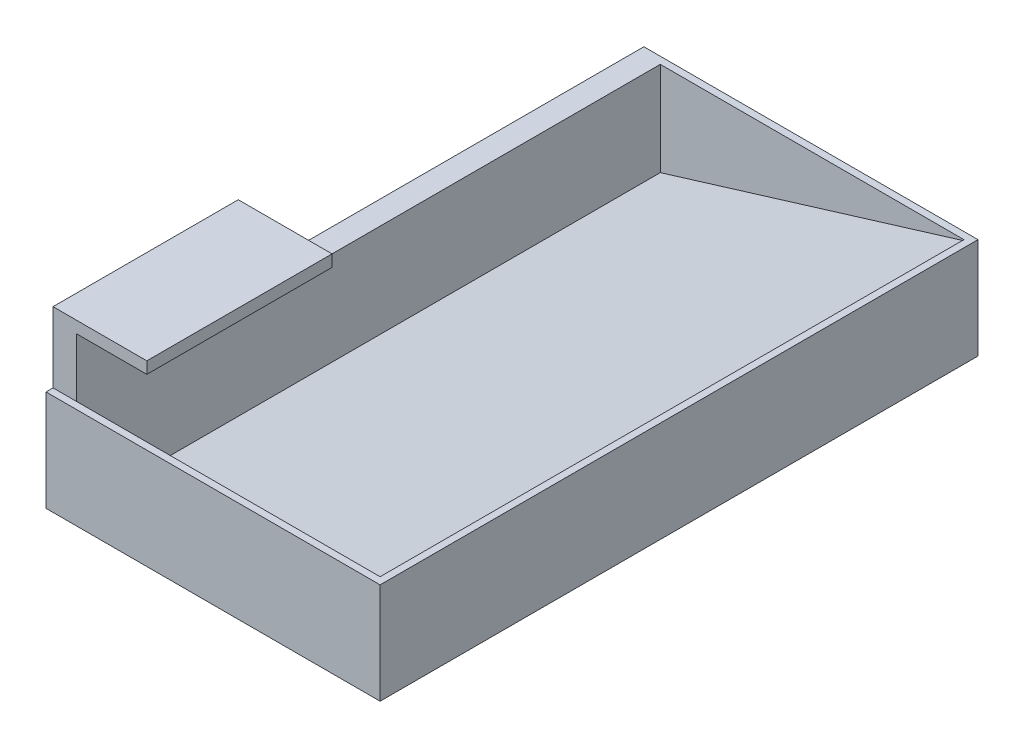
ISO-10303-21;
HEADER;
FILE_DESCRIPTION(('STEP AP214'),'2;1');
FILE_NAME('part.step','',(''),(''),'','','');
FILE_SCHEMA(('AUTOMOTIVE_DESIGN { 1 0 10303 214 1 1 1 1 }'));
ENDSEC;
DATA;
#1=APPLICATION_CONTEXT('core data for automotive mechanical design processes');
#2=APPLICATION_PROTOCOL_DEFINITION('international standard','automotive_design',2000,#1);
#3=PRODUCT_CONTEXT('',#1,'mechanical');
#4=PRODUCT('Part','Part','',(#3));
#5=PRODUCT_RELATED_PRODUCT_CATEGORY('part','',(#4));
#6=PRODUCT_DEFINITION_FORMATION('','',#4);
#7=PRODUCT_DEFINITION_CONTEXT('part definition',#1,'design');
#8=PRODUCT_DEFINITION('design','',#6,#7);
#9=PRODUCT_DEFINITION_SHAPE('','',#8);
#10=(LENGTH_UNIT() NAMED_UNIT(*) SI_UNIT(.MILLI.,.METRE.));
#11=(NAMED_UNIT(*) PLANE_ANGLE_UNIT() SI_UNIT($,.RADIAN.));
#12=(NAMED_UNIT(*) SI_UNIT($,.STERADIAN.) SOLID_ANGLE_UNIT());
#13=UNCERTAINTY_MEASURE_WITH_UNIT(LENGTH_MEASURE(1.E-05),#10,'distance_accuracy_value','');
#14=(GEOMETRIC_REPRESENTATION_CONTEXT(3) GLOBAL_UNCERTAINTY_ASSIGNED_CONTEXT((#13)) GLOBAL_UNIT_ASSIGNED_CONTEXT((#10,
#11,#12)) REPRESENTATION_CONTEXT('',''));
#15=CARTESIAN_POINT('',(0.,0.,0.));
#16=DIRECTION('',(0.,0.,1.));
#17=DIRECTION('',(1.,0.,0.));
#18=AXIS2_PLACEMENT_3D('',#15,#16,#17);
#19=CARTESIAN_POINT('',(0.,43.,0.));
#20=DIRECTION('',(0.,-1.,0.));
#21=DIRECTION('',(0.,0.,-1.));
#22=AXIS2_PLACEMENT_3D('',#19,#20,#21);
#23=PLANE('',#22);
#24=DIRECTION('',(1.,0.,0.));
#25=VECTOR('',#24,1.);
#26=CARTESIAN_POINT('',(0.,43.,-3.));
#27=LINE('',#26,#25);
#28=CARTESIAN_POINT('',(0.,43.,-3.));
#29=VERTEX_POINT('',#28);
#30=CARTESIAN_POINT('',(10.,43.,-3.));
#31=VERTEX_POINT('',#30);
#32=EDGE_CURVE('E291',#29,#31,#27,.T.);
#33=ORIENTED_EDGE('',*,*,#32,.F.);
#34=DIRECTION('',(0.,0.,1.));
#35=VECTOR('',#34,1.);
#36=CARTESIAN_POINT('',(0.,43.,0.));
#37=LINE('',#36,#35);
#38=CARTESIAN_POINT('',(0.,43.,0.));
#39=VERTEX_POINT('',#38);
#40=EDGE_CURVE('E195',#29,#39,#37,.T.);
#41=ORIENTED_EDGE('',*,*,#40,.T.);
#42=DIRECTION('',(1.,0.,0.));
#43=VECTOR('',#42,1.);
#44=CARTESIAN_POINT('',(0.,43.,0.));
#45=LINE('',#44,#43);
#46=CARTESIAN_POINT('',(142.5,43.,0.));
#47=VERTEX_POINT('',#46);
#48=EDGE_CURVE('E194',#39,#47,#45,.T.);
#49=ORIENTED_EDGE('',*,*,#48,.T.);
#50=DIRECTION('',(0.,0.,-1.));
#51=VECTOR('',#50,1.);
#52=CARTESIAN_POINT('',(142.5,43.,0.));
#53=LINE('',#52,#51);
#54=CARTESIAN_POINT('',(142.5,43.,-255.));
#55=VERTEX_POINT('',#54);
#56=EDGE_CURVE('E198',#47,#55,#53,.T.);
#57=ORIENTED_EDGE('',*,*,#56,.T.);
#58=DIRECTION('',(-1.,0.,0.));
#59=VECTOR('',#58,1.);
#60=CARTESIAN_POINT('',(0.,43.,-255.));
#61=LINE('',#60,#59);
#62=CARTESIAN_POINT('',(0.,43.,-255.));
#63=VERTEX_POINT('',#62);
#64=EDGE_CURVE('E201',#55,#63,#61,.T.);
#65=ORIENTED_EDGE('',*,*,#64,.T.);
#66=CARTESIAN_POINT('',(0.,43.,-82.));
#67=VERTEX_POINT('',#66);
#68=EDGE_CURVE('E190',#63,#67,#37,.T.);
#69=ORIENTED_EDGE('',*,*,#68,.T.);
#70=DIRECTION('',(1.,0.,0.));
#71=VECTOR('',#70,1.);
#72=CARTESIAN_POINT('',(0.,43.,-82.));
#73=LINE('',#72,#71);
#74=CARTESIAN_POINT('',(10.,43.,-82.));
#75=VERTEX_POINT('',#74);
#76=EDGE_CURVE('E251',#67,#75,#73,.T.);
#77=ORIENTED_EDGE('',*,*,#76,.T.);
#78=DIRECTION('',(0.,0.,1.));
#79=VECTOR('',#78,1.);
#80=CARTESIAN_POINT('',(10.,43.,-3.));
#81=LINE('',#80,#79);
#82=CARTESIAN_POINT('',(10.,43.,-252.));
#83=VERTEX_POINT('',#82);
#84=EDGE_CURVE('E171',#83,#75,#81,.T.);
#85=ORIENTED_EDGE('',*,*,#84,.F.);
#86=DIRECTION('',(-1.,0.,0.));
#87=VECTOR('',#86,1.);
#88=CARTESIAN_POINT('',(10.,43.,-252.));
#89=LINE('',#88,#87);
#90=CARTESIAN_POINT('',(139.5,43.,-252.));
#91=VERTEX_POINT('',#90);
#92=EDGE_CURVE('E161',#91,#83,#89,.T.);
#93=ORIENTED_EDGE('',*,*,#92,.F.);
#94=DIRECTION('',(0.,0.,-1.));
#95=VECTOR('',#94,1.);
#96=CARTESIAN_POINT('',(139.5,43.,-3.));
#97=LINE('',#96,#95);
#98=CARTESIAN_POINT('',(139.5,43.,-3.));
#99=VERTEX_POINT('',#98);
#100=EDGE_CURVE('E165',#99,#91,#97,.T.);
#101=ORIENTED_EDGE('',*,*,#100,.F.);
#102=DIRECTION('',(1.,0.,0.));
#103=VECTOR('',#102,1.);
#104=CARTESIAN_POINT('',(10.,43.,-3.));
#105=LINE('',#104,#103);
#106=EDGE_CURVE('E174',#31,#99,#105,.T.);
#107=ORIENTED_EDGE('',*,*,#106,.F.);
#108=EDGE_LOOP('',(#33,#41,#49,#57,#65,#69,#77,#85,#93,#101,#107));
#109=FACE_BOUND('',#108,.T.);
#110=ADVANCED_FACE('F39',(#109),#23,.F.);
#111=CARTESIAN_POINT('',(0.,43.,0.));
#112=DIRECTION('',(1.,0.,0.));
#113=DIRECTION('',(0.,0.,-1.));
#114=AXIS2_PLACEMENT_3D('',#111,#112,#113);
#115=PLANE('',#114);
#116=DIRECTION('',(0.,0.,1.));
#117=VECTOR('',#116,1.);
#118=CARTESIAN_POINT('',(0.,0.,0.));
#119=LINE('',#118,#117);
#120=CARTESIAN_POINT('',(0.,0.,-255.));
#121=VERTEX_POINT('',#120);
#122=CARTESIAN_POINT('',(0.,0.,0.));
#123=VERTEX_POINT('',#122);
#124=EDGE_CURVE('E184',#121,#123,#119,.T.);
#125=ORIENTED_EDGE('',*,*,#124,.T.);
#126=DIRECTION('',(0.,-1.,0.));
#127=VECTOR('',#126,1.);
#128=CARTESIAN_POINT('',(0.,43.,0.));
#129=LINE('',#128,#127);
#130=EDGE_CURVE('E11',#39,#123,#129,.T.);
#131=ORIENTED_EDGE('',*,*,#130,.F.);
#132=ORIENTED_EDGE('',*,*,#40,.F.);
#133=DIRECTION('',(0.,-1.,0.));
#134=VECTOR('',#133,1.);
#135=CARTESIAN_POINT('',(0.,73.,-3.));
#136=LINE('',#135,#134);
#137=CARTESIAN_POINT('',(0.,73.,-3.));
#138=VERTEX_POINT('',#137);
#139=EDGE_CURVE('E255',#138,#29,#136,.T.);
#140=ORIENTED_EDGE('',*,*,#139,.F.);
#141=DIRECTION('',(0.,0.,1.));
#142=VECTOR('',#141,1.);
#143=CARTESIAN_POINT('',(0.,73.,-82.));
#144=LINE('',#143,#142);
#145=CARTESIAN_POINT('',(0.,73.,-82.));
#146=VERTEX_POINT('',#145);
#147=EDGE_CURVE('E175',#146,#138,#144,.T.);
#148=ORIENTED_EDGE('',*,*,#147,.F.);
#149=DIRECTION('',(0.,-1.,0.));
#150=VECTOR('',#149,1.);
#151=CARTESIAN_POINT('',(0.,73.,-82.));
#152=LINE('',#151,#150);
#153=EDGE_CURVE('E246',#146,#67,#152,.T.);
#154=ORIENTED_EDGE('',*,*,#153,.T.);
#155=ORIENTED_EDGE('',*,*,#68,.F.);
#156=DIRECTION('',(0.,-1.,0.));
#157=VECTOR('',#156,1.);
#158=CARTESIAN_POINT('',(0.,43.,-255.));
#159=LINE('',#158,#157);
#160=EDGE_CURVE('E204',#63,#121,#159,.T.);
#161=ORIENTED_EDGE('',*,*,#160,.T.);
#162=EDGE_LOOP('',(#125,#131,#132,#140,#148,#154,#155,#161));
#163=FACE_BOUND('',#162,.T.);
#164=ADVANCED_FACE('F41',(#163),#115,.F.);
#165=CARTESIAN_POINT('',(0.,43.,0.));
#166=DIRECTION('',(0.,0.,-1.));
#167=DIRECTION('',(-1.,0.,0.));
#168=AXIS2_PLACEMENT_3D('',#165,#166,#167);
#169=PLANE('',#168);
#170=DIRECTION('',(1.,0.,0.));
#171=VECTOR('',#170,1.);
#172=CARTESIAN_POINT('',(0.,0.,0.));
#173=LINE('',#172,#171);
#174=CARTESIAN_POINT('',(142.5,0.,0.));
#175=VERTEX_POINT('',#174);
#176=EDGE_CURVE('E208',#123,#175,#173,.T.);
#177=ORIENTED_EDGE('',*,*,#176,.T.);
#178=DIRECTION('',(0.,-1.,0.));
#179=VECTOR('',#178,1.);
#180=CARTESIAN_POINT('',(142.5,43.,0.));
#181=LINE('',#180,#179);
#182=EDGE_CURVE('E48',#47,#175,#181,.T.);
#183=ORIENTED_EDGE('',*,*,#182,.F.);
#184=ORIENTED_EDGE('',*,*,#48,.F.);
#185=ORIENTED_EDGE('',*,*,#130,.T.);
#186=EDGE_LOOP('',(#177,#183,#184,#185));
#187=FACE_BOUND('',#186,.T.);
#188=ADVANCED_FACE('F253',(#187),#169,.F.);
#189=CARTESIAN_POINT('',(142.5,43.,0.));
#190=DIRECTION('',(-1.,0.,0.));
#191=DIRECTION('',(0.,0.,1.));
#192=AXIS2_PLACEMENT_3D('',#189,#190,#191);
#193=PLANE('',#192);
#194=DIRECTION('',(0.,0.,-1.));
#195=VECTOR('',#194,1.);
#196=CARTESIAN_POINT('',(142.5,0.,0.));
#197=LINE('',#196,#195);
#198=CARTESIAN_POINT('',(142.5,0.,-255.));
#199=VERTEX_POINT('',#198);
#200=EDGE_CURVE('E211',#175,#199,#197,.T.);
#201=ORIENTED_EDGE('',*,*,#200,.T.);
#202=DIRECTION('',(0.,-1.,0.));
#203=VECTOR('',#202,1.);
#204=CARTESIAN_POINT('',(142.5,43.,-255.));
#205=LINE('',#204,#203);
#206=EDGE_CURVE('E220',#55,#199,#205,.T.);
#207=ORIENTED_EDGE('',*,*,#206,.F.);
#208=ORIENTED_EDGE('',*,*,#56,.F.);
#209=ORIENTED_EDGE('',*,*,#182,.T.);
#210=EDGE_LOOP('',(#201,#207,#208,#209));
#211=FACE_BOUND('',#210,.T.);
#212=ADVANCED_FACE('F229',(#211),#193,.F.);
#213=CARTESIAN_POINT('',(0.,43.,-255.));
#214=DIRECTION('',(0.,0.,1.));
#215=DIRECTION('',(1.,0.,0.));
#216=AXIS2_PLACEMENT_3D('',#213,#214,#215);
#217=PLANE('',#216);
#218=DIRECTION('',(-1.,0.,0.));
#219=VECTOR('',#218,1.);
#220=CARTESIAN_POINT('',(0.,0.,-255.));
#221=LINE('',#220,#219);
#222=EDGE_CURVE('E214',#199,#121,#221,.T.);
#223=ORIENTED_EDGE('',*,*,#222,.T.);
#224=ORIENTED_EDGE('',*,*,#160,.F.);
#225=ORIENTED_EDGE('',*,*,#64,.F.);
#226=ORIENTED_EDGE('',*,*,#206,.T.);
#227=EDGE_LOOP('',(#223,#224,#225,#226));
#228=FACE_BOUND('',#227,.T.);
#229=ADVANCED_FACE('F239',(#228),#217,.F.);
#230=CARTESIAN_POINT('',(0.,0.,0.));
#231=DIRECTION('',(0.,-1.,0.));
#232=DIRECTION('',(0.,0.,-1.));
#233=AXIS2_PLACEMENT_3D('',#230,#231,#232);
#234=PLANE('',#233);
#235=ORIENTED_EDGE('',*,*,#124,.F.);
#236=ORIENTED_EDGE('',*,*,#222,.F.);
#237=ORIENTED_EDGE('',*,*,#200,.F.);
#238=ORIENTED_EDGE('',*,*,#176,.F.);
#239=EDGE_LOOP('',(#235,#236,#237,#238));
#240=FACE_BOUND('',#239,.T.);
#241=ADVANCED_FACE('F236',(#240),#234,.T.);
#242=CARTESIAN_POINT('',(10.,3.,-3.));
#243=DIRECTION('',(-1.,0.,0.));
#244=DIRECTION('',(0.,0.,1.));
#245=AXIS2_PLACEMENT_3D('',#242,#243,#244);
#246=PLANE('',#245);
#247=ORIENTED_EDGE('',*,*,#84,.T.);
#248=DIRECTION('',(0.,1.,0.));
#249=VECTOR('',#248,1.);
#250=CARTESIAN_POINT('',(10.,43.,-82.));
#251=LINE('',#250,#249);
#252=CARTESIAN_POINT('',(10.,68.,-82.));
#253=VERTEX_POINT('',#252);
#254=EDGE_CURVE('E265',#75,#253,#251,.T.);
#255=ORIENTED_EDGE('',*,*,#254,.T.);
#256=DIRECTION('',(0.,0.,1.));
#257=VECTOR('',#256,1.);
#258=CARTESIAN_POINT('',(10.,68.,-82.));
#259=LINE('',#258,#257);
#260=CARTESIAN_POINT('',(10.,68.,-3.));
#261=VERTEX_POINT('',#260);
#262=EDGE_CURVE('E169',#253,#261,#259,.T.);
#263=ORIENTED_EDGE('',*,*,#262,.T.);
#264=DIRECTION('',(0.,1.,0.));
#265=VECTOR('',#264,1.);
#266=CARTESIAN_POINT('',(10.,43.,-3.));
#267=LINE('',#266,#265);
#268=EDGE_CURVE('E145',#31,#261,#267,.T.);
#269=ORIENTED_EDGE('',*,*,#268,.F.);
#270=DIRECTION('',(0.,1.,0.));
#271=VECTOR('',#270,1.);
#272=CARTESIAN_POINT('',(10.,3.,-3.));
#273=LINE('',#272,#271);
#274=CARTESIAN_POINT('',(10.,3.,-3.));
#275=VERTEX_POINT('',#274);
#276=EDGE_CURVE('E138',#275,#31,#273,.T.);
#277=ORIENTED_EDGE('',*,*,#276,.F.);
#278=DIRECTION('',(0.,0.,1.));
#279=VECTOR('',#278,1.);
#280=CARTESIAN_POINT('',(10.,3.,-3.));
#281=LINE('',#280,#279);
#282=CARTESIAN_POINT('',(10.,3.,-252.));
#283=VERTEX_POINT('',#282);
#284=EDGE_CURVE('E143',#283,#275,#281,.T.);
#285=ORIENTED_EDGE('',*,*,#284,.F.);
#286=DIRECTION('',(0.,1.,0.));
#287=VECTOR('',#286,1.);
#288=CARTESIAN_POINT('',(10.,3.,-252.));
#289=LINE('',#288,#287);
#290=EDGE_CURVE('E181',#283,#83,#289,.T.);
#291=ORIENTED_EDGE('',*,*,#290,.T.);
#292=EDGE_LOOP('',(#247,#255,#263,#269,#277,#285,#291));
#293=FACE_BOUND('',#292,.T.);
#294=ADVANCED_FACE('F141',(#293),#246,.F.);
#295=CARTESIAN_POINT('',(10.,3.,-252.));
#296=DIRECTION('',(0.,0.,-1.));
#297=DIRECTION('',(-1.,0.,0.));
#298=AXIS2_PLACEMENT_3D('',#295,#296,#297);
#299=PLANE('',#298);
#300=ORIENTED_EDGE('',*,*,#290,.F.);
#301=DIRECTION('',(0.956304755963037,0.292371704722731,0.));
#302=VECTOR('',#301,1.);
#303=CARTESIAN_POINT('',(10.,3.,-252.));
#304=LINE('',#303,#302);
#305=CARTESIAN_POINT('',(139.5,42.5921232488956,-252.));
#306=VERTEX_POINT('',#305);
#307=EDGE_CURVE('E55',#283,#306,#304,.T.);
#308=ORIENTED_EDGE('',*,*,#307,.T.);
#309=DIRECTION('',(0.,1.,0.));
#310=VECTOR('',#309,1.);
#311=CARTESIAN_POINT('',(139.5,3.,-252.));
#312=LINE('',#311,#310);
#313=EDGE_CURVE('E185',#306,#91,#312,.T.);
#314=ORIENTED_EDGE('',*,*,#313,.T.);
#315=ORIENTED_EDGE('',*,*,#92,.T.);
#316=EDGE_LOOP('',(#300,#308,#314,#315));
#317=FACE_BOUND('',#316,.T.);
#318=ADVANCED_FACE('F327',(#317),#299,.F.);
#319=CARTESIAN_POINT('',(139.5,3.,-3.));
#320=DIRECTION('',(1.,0.,0.));
#321=DIRECTION('',(0.,0.,-1.));
#322=AXIS2_PLACEMENT_3D('',#319,#320,#321);
#323=PLANE('',#322);
#324=ORIENTED_EDGE('',*,*,#313,.F.);
#325=DIRECTION('',(0.,0.,1.));
#326=VECTOR('',#325,1.);
#327=CARTESIAN_POINT('',(139.5,42.5921232488956,-253.));
#328=LINE('',#327,#326);
#329=CARTESIAN_POINT('',(139.5,42.5921232488956,-3.));
#330=VERTEX_POINT('',#329);
#331=EDGE_CURVE('E62',#306,#330,#328,.T.);
#332=ORIENTED_EDGE('',*,*,#331,.T.);
#333=DIRECTION('',(0.,1.,0.));
#334=VECTOR('',#333,1.);
#335=CARTESIAN_POINT('',(139.5,3.,-3.));
#336=LINE('',#335,#334);
#337=EDGE_CURVE('E151',#330,#99,#336,.T.);
#338=ORIENTED_EDGE('',*,*,#337,.T.);
#339=ORIENTED_EDGE('',*,*,#100,.T.);
#340=EDGE_LOOP('',(#324,#332,#338,#339));
#341=FACE_BOUND('',#340,.T.);
#342=ADVANCED_FACE('F326',(#341),#323,.F.);
#343=CARTESIAN_POINT('',(10.,3.,-3.));
#344=DIRECTION('',(0.,0.,1.));
#345=DIRECTION('',(1.,0.,0.));
#346=AXIS2_PLACEMENT_3D('',#343,#344,#345);
#347=PLANE('',#346);
#348=ORIENTED_EDGE('',*,*,#337,.F.);
#349=DIRECTION('',(-0.956304755963037,-0.292371704722731,0.));
#350=VECTOR('',#349,1.);
#351=CARTESIAN_POINT('',(10.,3.,-3.));
#352=LINE('',#351,#350);
#353=EDGE_CURVE('E154',#330,#275,#352,.T.);
#354=ORIENTED_EDGE('',*,*,#353,.T.);
#355=ORIENTED_EDGE('',*,*,#276,.T.);
#356=ORIENTED_EDGE('',*,*,#106,.T.);
#357=EDGE_LOOP('',(#348,#354,#355,#356));
#358=FACE_BOUND('',#357,.T.);
#359=ADVANCED_FACE('F155',(#358),#347,.F.);
#360=CARTESIAN_POINT('',(40.,73.,-82.));
#361=DIRECTION('',(0.,1.,0.));
#362=DIRECTION('',(0.,0.,1.));
#363=AXIS2_PLACEMENT_3D('',#360,#361,#362);
#364=PLANE('',#363);
#365=DIRECTION('',(-1.,0.,0.));
#366=VECTOR('',#365,1.);
#367=CARTESIAN_POINT('',(40.,73.,-3.));
#368=LINE('',#367,#366);
#369=CARTESIAN_POINT('',(40.,73.,-3.));
#370=VERTEX_POINT('',#369);
#371=EDGE_CURVE('E261',#370,#138,#368,.T.);
#372=ORIENTED_EDGE('',*,*,#371,.F.);
#373=DIRECTION('',(0.,0.,1.));
#374=VECTOR('',#373,1.);
#375=CARTESIAN_POINT('',(40.,73.,-82.));
#376=LINE('',#375,#374);
#377=CARTESIAN_POINT('',(40.,73.,-82.));
#378=VERTEX_POINT('',#377);
#379=EDGE_CURVE('E273',#378,#370,#376,.T.);
#380=ORIENTED_EDGE('',*,*,#379,.F.);
#381=DIRECTION('',(-1.,0.,0.));
#382=VECTOR('',#381,1.);
#383=CARTESIAN_POINT('',(40.,73.,-82.));
#384=LINE('',#383,#382);
#385=EDGE_CURVE('E284',#378,#146,#384,.T.);
#386=ORIENTED_EDGE('',*,*,#385,.T.);
#387=ORIENTED_EDGE('',*,*,#147,.T.);
#388=EDGE_LOOP('',(#372,#380,#386,#387));
#389=FACE_BOUND('',#388,.T.);
#390=ADVANCED_FACE('F309',(#389),#364,.T.);
#391=CARTESIAN_POINT('',(40.,68.,-82.));
#392=DIRECTION('',(1.,0.,0.));
#393=DIRECTION('',(0.,0.,-1.));
#394=AXIS2_PLACEMENT_3D('',#391,#392,#393);
#395=PLANE('',#394);
#396=DIRECTION('',(0.,1.,0.));
#397=VECTOR('',#396,1.);
#398=CARTESIAN_POINT('',(40.,68.,-3.));
#399=LINE('',#398,#397);
#400=CARTESIAN_POINT('',(40.,68.,-3.));
#401=VERTEX_POINT('',#400);
#402=EDGE_CURVE('E267',#401,#370,#399,.T.);
#403=ORIENTED_EDGE('',*,*,#402,.F.);
#404=DIRECTION('',(0.,0.,1.));
#405=VECTOR('',#404,1.);
#406=CARTESIAN_POINT('',(40.,68.,-82.));
#407=LINE('',#406,#405);
#408=CARTESIAN_POINT('',(40.,68.,-82.));
#409=VERTEX_POINT('',#408);
#410=EDGE_CURVE('E275',#409,#401,#407,.T.);
#411=ORIENTED_EDGE('',*,*,#410,.F.);
#412=DIRECTION('',(0.,1.,0.));
#413=VECTOR('',#412,1.);
#414=CARTESIAN_POINT('',(40.,68.,-82.));
#415=LINE('',#414,#413);
#416=EDGE_CURVE('E287',#409,#378,#415,.T.);
#417=ORIENTED_EDGE('',*,*,#416,.T.);
#418=ORIENTED_EDGE('',*,*,#379,.T.);
#419=EDGE_LOOP('',(#403,#411,#417,#418));
#420=FACE_BOUND('',#419,.T.);
#421=ADVANCED_FACE('F304',(#420),#395,.T.);
#422=CARTESIAN_POINT('',(10.,68.,-82.));
#423=DIRECTION('',(0.,-1.,0.));
#424=DIRECTION('',(0.,0.,-1.));
#425=AXIS2_PLACEMENT_3D('',#422,#423,#424);
#426=PLANE('',#425);
#427=DIRECTION('',(1.,0.,0.));
#428=VECTOR('',#427,1.);
#429=CARTESIAN_POINT('',(10.,68.,-3.));
#430=LINE('',#429,#428);
#431=EDGE_CURVE('E296',#261,#401,#430,.T.);
#432=ORIENTED_EDGE('',*,*,#431,.F.);
#433=ORIENTED_EDGE('',*,*,#262,.F.);
#434=DIRECTION('',(1.,0.,0.));
#435=VECTOR('',#434,1.);
#436=CARTESIAN_POINT('',(10.,68.,-82.));
#437=LINE('',#436,#435);
#438=EDGE_CURVE('E313',#253,#409,#437,.T.);
#439=ORIENTED_EDGE('',*,*,#438,.T.);
#440=ORIENTED_EDGE('',*,*,#410,.T.);
#441=EDGE_LOOP('',(#432,#433,#439,#440));
#442=FACE_BOUND('',#441,.T.);
#443=ADVANCED_FACE('F323',(#442),#426,.T.);
#444=CARTESIAN_POINT('',(0.,0.,-82.));
#445=DIRECTION('',(0.,0.,1.));
#446=DIRECTION('',(1.,0.,0.));
#447=AXIS2_PLACEMENT_3D('',#444,#445,#446);
#448=PLANE('',#447);
#449=ORIENTED_EDGE('',*,*,#76,.F.);
#450=ORIENTED_EDGE('',*,*,#153,.F.);
#451=ORIENTED_EDGE('',*,*,#385,.F.);
#452=ORIENTED_EDGE('',*,*,#416,.F.);
#453=ORIENTED_EDGE('',*,*,#438,.F.);
#454=ORIENTED_EDGE('',*,*,#254,.F.);
#455=EDGE_LOOP('',(#449,#450,#451,#452,#453,#454));
#456=FACE_BOUND('',#455,.T.);
#457=ADVANCED_FACE('F311',(#456),#448,.F.);
#458=CARTESIAN_POINT('',(0.,0.,-3.));
#459=DIRECTION('',(0.,0.,1.));
#460=DIRECTION('',(1.,0.,0.));
#461=AXIS2_PLACEMENT_3D('',#458,#459,#460);
#462=PLANE('',#461);
#463=ORIENTED_EDGE('',*,*,#32,.T.);
#464=ORIENTED_EDGE('',*,*,#268,.T.);
#465=ORIENTED_EDGE('',*,*,#431,.T.);
#466=ORIENTED_EDGE('',*,*,#402,.T.);
#467=ORIENTED_EDGE('',*,*,#371,.T.);
#468=ORIENTED_EDGE('',*,*,#139,.T.);
#469=EDGE_LOOP('',(#463,#464,#465,#466,#467,#468));
#470=FACE_BOUND('',#469,.T.);
#471=ADVANCED_FACE('F301',(#470),#462,.T.);
#472=CARTESIAN_POINT('',(10.,3.,-253.));
#473=DIRECTION('',(-0.292371704722731,0.956304755963037,0.));
#474=DIRECTION('',(-0.956304755963037,-0.292371704722731,0.));
#475=AXIS2_PLACEMENT_3D('',#472,#473,#474);
#476=PLANE('',#475);
#477=ORIENTED_EDGE('',*,*,#307,.F.);
#478=ORIENTED_EDGE('',*,*,#284,.T.);
#479=ORIENTED_EDGE('',*,*,#353,.F.);
#480=ORIENTED_EDGE('',*,*,#331,.F.);
#481=EDGE_LOOP('',(#477,#478,#479,#480));
#482=FACE_BOUND('',#481,.T.);
#483=ADVANCED_FACE('F159',(#482),#476,.T.);
#484=CLOSED_SHELL('',(#110,#164,#188,#212,#229,#241,#294,#318,#342,#359,#390,#421,#443,#457,
#471,#483));
#485=MANIFOLD_SOLID_BREP('B2',#484);
#486=ADVANCED_BREP_SHAPE_REPRESENTATION('',(#18,#485),#14);
#487=SHAPE_DEFINITION_REPRESENTATION(#9,#486);
ENDSEC;
END-ISO-10303-21;
